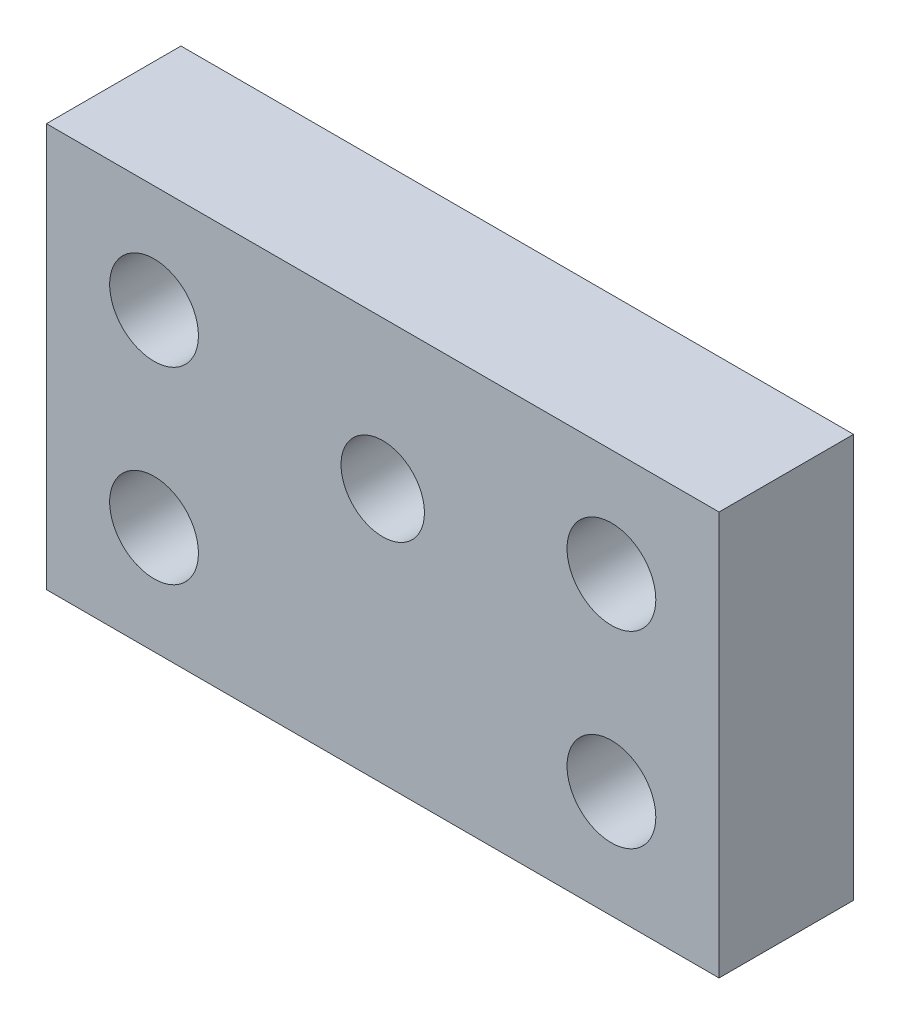
ISO-10303-21;
HEADER;
FILE_DESCRIPTION(('STEP AP214'),'2;1');
FILE_NAME('part.step','',(''),(''),'','','');
FILE_SCHEMA(('AUTOMOTIVE_DESIGN { 1 0 10303 214 1 1 1 1 }'));
ENDSEC;
DATA;
#1=APPLICATION_CONTEXT('core data for automotive mechanical design processes');
#2=APPLICATION_PROTOCOL_DEFINITION('international standard','automotive_design',2000,#1);
#3=PRODUCT_CONTEXT('',#1,'mechanical');
#4=PRODUCT('Part','Part','',(#3));
#5=PRODUCT_RELATED_PRODUCT_CATEGORY('part','',(#4));
#6=PRODUCT_DEFINITION_FORMATION('','',#4);
#7=PRODUCT_DEFINITION_CONTEXT('part definition',#1,'design');
#8=PRODUCT_DEFINITION('design','',#6,#7);
#9=PRODUCT_DEFINITION_SHAPE('','',#8);
#10=(LENGTH_UNIT() NAMED_UNIT(*) SI_UNIT(.MILLI.,.METRE.));
#11=(NAMED_UNIT(*) PLANE_ANGLE_UNIT() SI_UNIT($,.RADIAN.));
#12=(NAMED_UNIT(*) SI_UNIT($,.STERADIAN.) SOLID_ANGLE_UNIT());
#13=UNCERTAINTY_MEASURE_WITH_UNIT(LENGTH_MEASURE(1.E-05),#10,'distance_accuracy_value','');
#14=(GEOMETRIC_REPRESENTATION_CONTEXT(3) GLOBAL_UNCERTAINTY_ASSIGNED_CONTEXT((#13)) GLOBAL_UNIT_ASSIGNED_CONTEXT((#10,
#11,#12)) REPRESENTATION_CONTEXT('',''));
#15=CARTESIAN_POINT('',(0.,0.,0.));
#16=DIRECTION('',(0.,0.,1.));
#17=DIRECTION('',(1.,0.,0.));
#18=AXIS2_PLACEMENT_3D('',#15,#16,#17);
#19=CARTESIAN_POINT('',(0.,0.,5.));
#20=DIRECTION('',(0.,0.,1.));
#21=DIRECTION('',(1.,0.,0.));
#22=AXIS2_PLACEMENT_3D('',#19,#20,#21);
#23=PLANE('',#22);
#24=CARTESIAN_POINT('',(8.5,5.5,5.));
#25=DIRECTION('',(0.,0.,1.));
#26=DIRECTION('',(1.,0.,0.));
#27=AXIS2_PLACEMENT_3D('',#24,#25,#26);
#28=CIRCLE('',#27,1.55);
#29=CARTESIAN_POINT('',(10.05,5.5,5.));
#30=VERTEX_POINT('',#29);
#31=EDGE_CURVE('E136',#30,#30,#28,.T.);
#32=ORIENTED_EDGE('',*,*,#31,.F.);
#33=EDGE_LOOP('',(#32));
#34=FACE_BOUND('',#33,.T.);
#35=CARTESIAN_POINT('',(17.,0.,5.));
#36=DIRECTION('',(0.,0.,1.));
#37=DIRECTION('',(1.,0.,0.));
#38=AXIS2_PLACEMENT_3D('',#35,#36,#37);
#39=CIRCLE('',#38,1.65);
#40=CARTESIAN_POINT('',(18.65,0.,5.));
#41=VERTEX_POINT('',#40);
#42=EDGE_CURVE('E121',#41,#41,#39,.T.);
#43=ORIENTED_EDGE('',*,*,#42,.F.);
#44=EDGE_LOOP('',(#43));
#45=FACE_BOUND('',#44,.T.);
#46=CARTESIAN_POINT('',(0.,0.,5.));
#47=DIRECTION('',(0.,0.,1.));
#48=DIRECTION('',(1.,0.,0.));
#49=AXIS2_PLACEMENT_3D('',#46,#47,#48);
#50=CIRCLE('',#49,1.65);
#51=CARTESIAN_POINT('',(1.65,0.,5.));
#52=VERTEX_POINT('',#51);
#53=EDGE_CURVE('E100',#52,#52,#50,.T.);
#54=ORIENTED_EDGE('',*,*,#53,.F.);
#55=EDGE_LOOP('',(#54));
#56=FACE_BOUND('',#55,.T.);
#57=DIRECTION('',(0.,1.,0.));
#58=VECTOR('',#57,1.);
#59=CARTESIAN_POINT('',(21.,11.,5.));
#60=LINE('',#59,#58);
#61=CARTESIAN_POINT('',(21.,-4.,5.));
#62=VERTEX_POINT('',#61);
#63=CARTESIAN_POINT('',(21.,11.,5.));
#64=VERTEX_POINT('',#63);
#65=EDGE_CURVE('E85',#62,#64,#60,.T.);
#66=ORIENTED_EDGE('',*,*,#65,.T.);
#67=DIRECTION('',(-1.,0.,0.));
#68=VECTOR('',#67,1.);
#69=CARTESIAN_POINT('',(-4.,11.,5.));
#70=LINE('',#69,#68);
#71=CARTESIAN_POINT('',(-4.,11.,5.));
#72=VERTEX_POINT('',#71);
#73=EDGE_CURVE('E80',#64,#72,#70,.T.);
#74=ORIENTED_EDGE('',*,*,#73,.T.);
#75=DIRECTION('',(0.,-1.,0.));
#76=VECTOR('',#75,1.);
#77=CARTESIAN_POINT('',(-4.,11.,5.));
#78=LINE('',#77,#76);
#79=CARTESIAN_POINT('',(-4.,-4.,5.));
#80=VERTEX_POINT('',#79);
#81=EDGE_CURVE('E83',#72,#80,#78,.T.);
#82=ORIENTED_EDGE('',*,*,#81,.T.);
#83=DIRECTION('',(1.,0.,0.));
#84=VECTOR('',#83,1.);
#85=CARTESIAN_POINT('',(-4.,-4.,5.));
#86=LINE('',#85,#84);
#87=EDGE_CURVE('E50',#80,#62,#86,.T.);
#88=ORIENTED_EDGE('',*,*,#87,.T.);
#89=EDGE_LOOP('',(#66,#74,#82,#88));
#90=FACE_BOUND('',#89,.T.);
#91=CARTESIAN_POINT('',(0.,7.,5.));
#92=DIRECTION('',(0.,0.,1.));
#93=DIRECTION('',(1.,0.,0.));
#94=AXIS2_PLACEMENT_3D('',#91,#92,#93);
#95=CIRCLE('',#94,1.65);
#96=CARTESIAN_POINT('',(1.65,7.,5.));
#97=VERTEX_POINT('',#96);
#98=EDGE_CURVE('E115',#97,#97,#95,.T.);
#99=ORIENTED_EDGE('',*,*,#98,.F.);
#100=EDGE_LOOP('',(#99));
#101=FACE_BOUND('',#100,.T.);
#102=CARTESIAN_POINT('',(17.,7.,5.));
#103=DIRECTION('',(0.,0.,1.));
#104=DIRECTION('',(1.,0.,0.));
#105=AXIS2_PLACEMENT_3D('',#102,#103,#104);
#106=CIRCLE('',#105,1.65);
#107=CARTESIAN_POINT('',(18.65,7.,5.));
#108=VERTEX_POINT('',#107);
#109=EDGE_CURVE('E127',#108,#108,#106,.T.);
#110=ORIENTED_EDGE('',*,*,#109,.F.);
#111=EDGE_LOOP('',(#110));
#112=FACE_BOUND('',#111,.T.);
#113=ADVANCED_FACE('F33',(#34,#45,#56,#90,#101,#112),#23,.T.);
#114=CARTESIAN_POINT('',(0.,0.,0.));
#115=DIRECTION('',(0.,0.,1.));
#116=DIRECTION('',(1.,0.,0.));
#117=AXIS2_PLACEMENT_3D('',#114,#115,#116);
#118=PLANE('',#117);
#119=CARTESIAN_POINT('',(8.5,5.5,0.));
#120=DIRECTION('',(0.,0.,1.));
#121=DIRECTION('',(1.,0.,0.));
#122=AXIS2_PLACEMENT_3D('',#119,#120,#121);
#123=CIRCLE('',#122,1.55);
#124=CARTESIAN_POINT('',(10.05,5.5,0.));
#125=VERTEX_POINT('',#124);
#126=EDGE_CURVE('E133',#125,#125,#123,.T.);
#127=ORIENTED_EDGE('',*,*,#126,.T.);
#128=EDGE_LOOP('',(#127));
#129=FACE_BOUND('',#128,.T.);
#130=DIRECTION('',(0.,1.,0.));
#131=VECTOR('',#130,1.);
#132=CARTESIAN_POINT('',(21.,11.,0.));
#133=LINE('',#132,#131);
#134=CARTESIAN_POINT('',(21.,-4.,0.));
#135=VERTEX_POINT('',#134);
#136=CARTESIAN_POINT('',(21.,11.,0.));
#137=VERTEX_POINT('',#136);
#138=EDGE_CURVE('E97',#135,#137,#133,.T.);
#139=ORIENTED_EDGE('',*,*,#138,.F.);
#140=DIRECTION('',(1.,0.,0.));
#141=VECTOR('',#140,1.);
#142=CARTESIAN_POINT('',(-4.,-4.,0.));
#143=LINE('',#142,#141);
#144=CARTESIAN_POINT('',(-4.,-4.,0.));
#145=VERTEX_POINT('',#144);
#146=EDGE_CURVE('E73',#145,#135,#143,.T.);
#147=ORIENTED_EDGE('',*,*,#146,.F.);
#148=DIRECTION('',(0.,-1.,0.));
#149=VECTOR('',#148,1.);
#150=CARTESIAN_POINT('',(-4.,11.,0.));
#151=LINE('',#150,#149);
#152=CARTESIAN_POINT('',(-4.,11.,0.));
#153=VERTEX_POINT('',#152);
#154=EDGE_CURVE('E67',#153,#145,#151,.T.);
#155=ORIENTED_EDGE('',*,*,#154,.F.);
#156=DIRECTION('',(-1.,0.,0.));
#157=VECTOR('',#156,1.);
#158=CARTESIAN_POINT('',(-4.,11.,0.));
#159=LINE('',#158,#157);
#160=EDGE_CURVE('E89',#137,#153,#159,.T.);
#161=ORIENTED_EDGE('',*,*,#160,.F.);
#162=EDGE_LOOP('',(#139,#147,#155,#161));
#163=FACE_BOUND('',#162,.T.);
#164=CARTESIAN_POINT('',(0.,0.,0.));
#165=DIRECTION('',(0.,0.,1.));
#166=DIRECTION('',(1.,0.,0.));
#167=AXIS2_PLACEMENT_3D('',#164,#165,#166);
#168=CIRCLE('',#167,1.65);
#169=CARTESIAN_POINT('',(1.65,0.,0.));
#170=VERTEX_POINT('',#169);
#171=EDGE_CURVE('E112',#170,#170,#168,.T.);
#172=ORIENTED_EDGE('',*,*,#171,.T.);
#173=EDGE_LOOP('',(#172));
#174=FACE_BOUND('',#173,.T.);
#175=CARTESIAN_POINT('',(0.,7.,0.));
#176=DIRECTION('',(0.,0.,1.));
#177=DIRECTION('',(1.,0.,0.));
#178=AXIS2_PLACEMENT_3D('',#175,#176,#177);
#179=CIRCLE('',#178,1.65);
#180=CARTESIAN_POINT('',(1.65,7.,0.));
#181=VERTEX_POINT('',#180);
#182=EDGE_CURVE('E118',#181,#181,#179,.T.);
#183=ORIENTED_EDGE('',*,*,#182,.T.);
#184=EDGE_LOOP('',(#183));
#185=FACE_BOUND('',#184,.T.);
#186=CARTESIAN_POINT('',(17.,0.,0.));
#187=DIRECTION('',(0.,0.,1.));
#188=DIRECTION('',(1.,0.,0.));
#189=AXIS2_PLACEMENT_3D('',#186,#187,#188);
#190=CIRCLE('',#189,1.65);
#191=CARTESIAN_POINT('',(18.65,0.,0.));
#192=VERTEX_POINT('',#191);
#193=EDGE_CURVE('E124',#192,#192,#190,.T.);
#194=ORIENTED_EDGE('',*,*,#193,.T.);
#195=EDGE_LOOP('',(#194));
#196=FACE_BOUND('',#195,.T.);
#197=CARTESIAN_POINT('',(17.,7.,0.));
#198=DIRECTION('',(0.,0.,1.));
#199=DIRECTION('',(1.,0.,0.));
#200=AXIS2_PLACEMENT_3D('',#197,#198,#199);
#201=CIRCLE('',#200,1.65);
#202=CARTESIAN_POINT('',(18.65,7.,0.));
#203=VERTEX_POINT('',#202);
#204=EDGE_CURVE('E130',#203,#203,#201,.T.);
#205=ORIENTED_EDGE('',*,*,#204,.T.);
#206=EDGE_LOOP('',(#205));
#207=FACE_BOUND('',#206,.T.);
#208=ADVANCED_FACE('F108',(#129,#163,#174,#185,#196,#207),#118,.F.);
#209=CARTESIAN_POINT('',(21.,11.,5.));
#210=DIRECTION('',(-1.,0.,0.));
#211=DIRECTION('',(0.,-1.,0.));
#212=AXIS2_PLACEMENT_3D('',#209,#210,#211);
#213=PLANE('',#212);
#214=ORIENTED_EDGE('',*,*,#138,.T.);
#215=DIRECTION('',(0.,0.,-1.));
#216=VECTOR('',#215,1.);
#217=CARTESIAN_POINT('',(21.,11.,5.));
#218=LINE('',#217,#216);
#219=EDGE_CURVE('E11',#64,#137,#218,.T.);
#220=ORIENTED_EDGE('',*,*,#219,.F.);
#221=ORIENTED_EDGE('',*,*,#65,.F.);
#222=DIRECTION('',(0.,0.,-1.));
#223=VECTOR('',#222,1.);
#224=CARTESIAN_POINT('',(21.,-4.,5.));
#225=LINE('',#224,#223);
#226=EDGE_CURVE('E93',#62,#135,#225,.T.);
#227=ORIENTED_EDGE('',*,*,#226,.T.);
#228=EDGE_LOOP('',(#214,#220,#221,#227));
#229=FACE_BOUND('',#228,.T.);
#230=ADVANCED_FACE('F35',(#229),#213,.F.);
#231=CARTESIAN_POINT('',(-4.,11.,5.));
#232=DIRECTION('',(0.,-1.,0.));
#233=DIRECTION('',(0.,0.,-1.));
#234=AXIS2_PLACEMENT_3D('',#231,#232,#233);
#235=PLANE('',#234);
#236=ORIENTED_EDGE('',*,*,#160,.T.);
#237=DIRECTION('',(0.,0.,-1.));
#238=VECTOR('',#237,1.);
#239=CARTESIAN_POINT('',(-4.,11.,5.));
#240=LINE('',#239,#238);
#241=EDGE_CURVE('E42',#72,#153,#240,.T.);
#242=ORIENTED_EDGE('',*,*,#241,.F.);
#243=ORIENTED_EDGE('',*,*,#73,.F.);
#244=ORIENTED_EDGE('',*,*,#219,.T.);
#245=EDGE_LOOP('',(#236,#242,#243,#244));
#246=FACE_BOUND('',#245,.T.);
#247=ADVANCED_FACE('F88',(#246),#235,.F.);
#248=CARTESIAN_POINT('',(-4.,11.,5.));
#249=DIRECTION('',(1.,0.,0.));
#250=DIRECTION('',(0.,1.,0.));
#251=AXIS2_PLACEMENT_3D('',#248,#249,#250);
#252=PLANE('',#251);
#253=ORIENTED_EDGE('',*,*,#154,.T.);
#254=DIRECTION('',(0.,0.,-1.));
#255=VECTOR('',#254,1.);
#256=CARTESIAN_POINT('',(-4.,-4.,5.));
#257=LINE('',#256,#255);
#258=EDGE_CURVE('E90',#80,#145,#257,.T.);
#259=ORIENTED_EDGE('',*,*,#258,.F.);
#260=ORIENTED_EDGE('',*,*,#81,.F.);
#261=ORIENTED_EDGE('',*,*,#241,.T.);
#262=EDGE_LOOP('',(#253,#259,#260,#261));
#263=FACE_BOUND('',#262,.T.);
#264=ADVANCED_FACE('F91',(#263),#252,.F.);
#265=CARTESIAN_POINT('',(-4.,-4.,5.));
#266=DIRECTION('',(0.,1.,0.));
#267=DIRECTION('',(0.,0.,1.));
#268=AXIS2_PLACEMENT_3D('',#265,#266,#267);
#269=PLANE('',#268);
#270=ORIENTED_EDGE('',*,*,#146,.T.);
#271=ORIENTED_EDGE('',*,*,#226,.F.);
#272=ORIENTED_EDGE('',*,*,#87,.F.);
#273=ORIENTED_EDGE('',*,*,#258,.T.);
#274=EDGE_LOOP('',(#270,#271,#272,#273));
#275=FACE_BOUND('',#274,.T.);
#276=ADVANCED_FACE('F105',(#275),#269,.F.);
#277=CARTESIAN_POINT('',(0.,0.,5.));
#278=DIRECTION('',(0.,0.,-1.));
#279=DIRECTION('',(-1.,0.,0.));
#280=AXIS2_PLACEMENT_3D('',#277,#278,#279);
#281=CYLINDRICAL_SURFACE('',#280,1.65);
#282=ORIENTED_EDGE('',*,*,#53,.T.);
#283=EDGE_LOOP('',(#282));
#284=FACE_BOUND('',#283,.T.);
#285=ORIENTED_EDGE('',*,*,#171,.F.);
#286=EDGE_LOOP('',(#285));
#287=FACE_BOUND('',#286,.T.);
#288=ADVANCED_FACE('F157',(#284,#287),#281,.F.);
#289=CARTESIAN_POINT('',(0.,7.,5.));
#290=DIRECTION('',(0.,0.,-1.));
#291=DIRECTION('',(-1.,0.,0.));
#292=AXIS2_PLACEMENT_3D('',#289,#290,#291);
#293=CYLINDRICAL_SURFACE('',#292,1.65);
#294=ORIENTED_EDGE('',*,*,#98,.T.);
#295=EDGE_LOOP('',(#294));
#296=FACE_BOUND('',#295,.T.);
#297=ORIENTED_EDGE('',*,*,#182,.F.);
#298=EDGE_LOOP('',(#297));
#299=FACE_BOUND('',#298,.T.);
#300=ADVANCED_FACE('F160',(#296,#299),#293,.F.);
#301=CARTESIAN_POINT('',(17.,0.,5.));
#302=DIRECTION('',(0.,0.,-1.));
#303=DIRECTION('',(-1.,0.,0.));
#304=AXIS2_PLACEMENT_3D('',#301,#302,#303);
#305=CYLINDRICAL_SURFACE('',#304,1.65);
#306=ORIENTED_EDGE('',*,*,#42,.T.);
#307=EDGE_LOOP('',(#306));
#308=FACE_BOUND('',#307,.T.);
#309=ORIENTED_EDGE('',*,*,#193,.F.);
#310=EDGE_LOOP('',(#309));
#311=FACE_BOUND('',#310,.T.);
#312=ADVANCED_FACE('F173',(#308,#311),#305,.F.);
#313=CARTESIAN_POINT('',(17.,7.,5.));
#314=DIRECTION('',(0.,0.,-1.));
#315=DIRECTION('',(-1.,0.,0.));
#316=AXIS2_PLACEMENT_3D('',#313,#314,#315);
#317=CYLINDRICAL_SURFACE('',#316,1.65);
#318=ORIENTED_EDGE('',*,*,#109,.T.);
#319=EDGE_LOOP('',(#318));
#320=FACE_BOUND('',#319,.T.);
#321=ORIENTED_EDGE('',*,*,#204,.F.);
#322=EDGE_LOOP('',(#321));
#323=FACE_BOUND('',#322,.T.);
#324=ADVANCED_FACE('F146',(#320,#323),#317,.F.);
#325=CARTESIAN_POINT('',(8.5,5.5,0.));
#326=DIRECTION('',(0.,0.,1.));
#327=DIRECTION('',(1.,0.,0.));
#328=AXIS2_PLACEMENT_3D('',#325,#326,#327);
#329=CYLINDRICAL_SURFACE('',#328,1.55);
#330=ORIENTED_EDGE('',*,*,#126,.F.);
#331=EDGE_LOOP('',(#330));
#332=FACE_BOUND('',#331,.T.);
#333=ORIENTED_EDGE('',*,*,#31,.T.);
#334=EDGE_LOOP('',(#333));
#335=FACE_BOUND('',#334,.T.);
#336=ADVANCED_FACE('F143',(#332,#335),#329,.F.);
#337=CLOSED_SHELL('',(#113,#208,#230,#247,#264,#276,#288,#300,#312,#324,#336));
#338=MANIFOLD_SOLID_BREP('B2',#337);
#339=ADVANCED_BREP_SHAPE_REPRESENTATION('',(#18,#338),#14);
#340=SHAPE_DEFINITION_REPRESENTATION(#9,#339);
ENDSEC;
END-ISO-10303-21;
